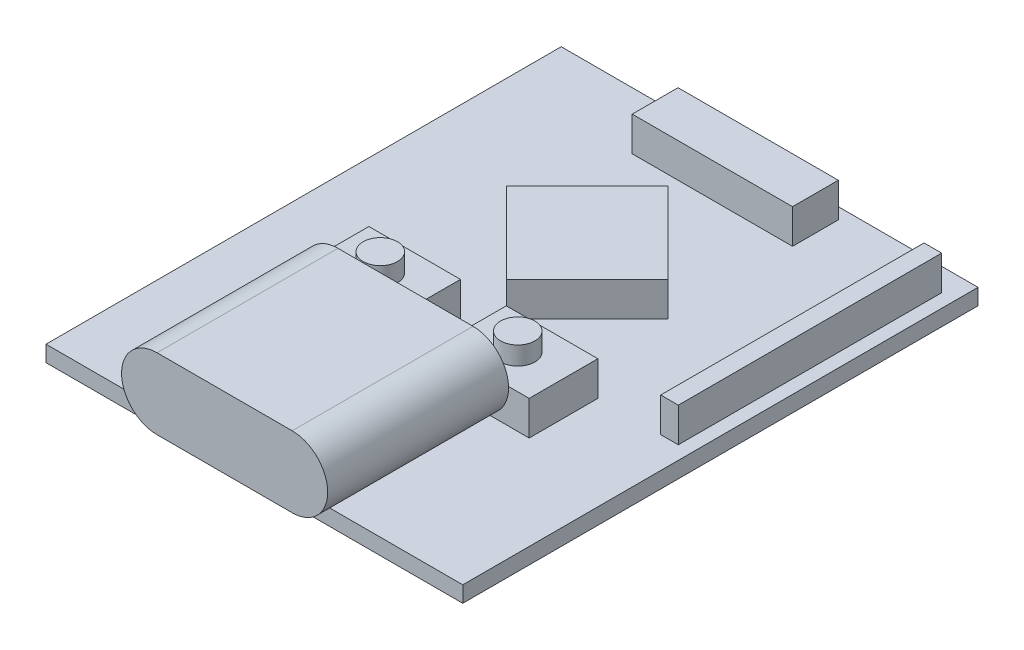
ISO-10303-21;
HEADER;
FILE_DESCRIPTION(('STEP AP214'),'2;1');
FILE_NAME('part.step','',(''),(''),'','','');
FILE_SCHEMA(('AUTOMOTIVE_DESIGN { 1 0 10303 214 1 1 1 1 }'));
ENDSEC;
DATA;
#1=APPLICATION_CONTEXT('core data for automotive mechanical design processes');
#2=APPLICATION_PROTOCOL_DEFINITION('international standard','automotive_design',2000,#1);
#3=PRODUCT_CONTEXT('',#1,'mechanical');
#4=PRODUCT('Part','Part','',(#3));
#5=PRODUCT_RELATED_PRODUCT_CATEGORY('part','',(#4));
#6=PRODUCT_DEFINITION_FORMATION('','',#4);
#7=PRODUCT_DEFINITION_CONTEXT('part definition',#1,'design');
#8=PRODUCT_DEFINITION('design','',#6,#7);
#9=PRODUCT_DEFINITION_SHAPE('','',#8);
#10=(LENGTH_UNIT() NAMED_UNIT(*) SI_UNIT(.MILLI.,.METRE.));
#11=(NAMED_UNIT(*) PLANE_ANGLE_UNIT() SI_UNIT($,.RADIAN.));
#12=(NAMED_UNIT(*) SI_UNIT($,.STERADIAN.) SOLID_ANGLE_UNIT());
#13=UNCERTAINTY_MEASURE_WITH_UNIT(LENGTH_MEASURE(1.E-05),#10,'distance_accuracy_value','');
#14=(GEOMETRIC_REPRESENTATION_CONTEXT(3) GLOBAL_UNCERTAINTY_ASSIGNED_CONTEXT((#13)) GLOBAL_UNIT_ASSIGNED_CONTEXT((#10,
#11,#12)) REPRESENTATION_CONTEXT('',''));
#15=CARTESIAN_POINT('',(0.,0.,0.));
#16=DIRECTION('',(0.,0.,1.));
#17=DIRECTION('',(1.,0.,0.));
#18=AXIS2_PLACEMENT_3D('',#15,#16,#17);
#19=CARTESIAN_POINT('',(-2.95,2.55,-6.6));
#20=DIRECTION('',(0.,0.,1.));
#21=DIRECTION('',(1.,0.,0.));
#22=AXIS2_PLACEMENT_3D('',#19,#20,#21);
#23=CYLINDRICAL_SURFACE('',#22,1.55);
#24=CARTESIAN_POINT('',(-2.95,2.55,1.3));
#25=DIRECTION('',(0.,0.,1.));
#26=DIRECTION('',(1.,0.,0.));
#27=AXIS2_PLACEMENT_3D('',#24,#25,#26);
#28=CIRCLE('',#27,1.55);
#29=CARTESIAN_POINT('',(-2.95,4.1,1.3));
#30=VERTEX_POINT('',#29);
#31=CARTESIAN_POINT('',(-2.95,1.,1.3));
#32=VERTEX_POINT('',#31);
#33=EDGE_CURVE('E109',#30,#32,#28,.T.);
#34=ORIENTED_EDGE('',*,*,#33,.F.);
#35=DIRECTION('',(0.,0.,1.));
#36=VECTOR('',#35,1.);
#37=CARTESIAN_POINT('',(-2.95,4.1,-6.6));
#38=LINE('',#37,#36);
#39=CARTESIAN_POINT('',(-2.95,4.1,-6.6));
#40=VERTEX_POINT('',#39);
#41=EDGE_CURVE('E12',#40,#30,#38,.T.);
#42=ORIENTED_EDGE('',*,*,#41,.F.);
#43=CARTESIAN_POINT('',(-2.95,2.55,-6.6));
#44=DIRECTION('',(0.,0.,1.));
#45=DIRECTION('',(1.,0.,0.));
#46=AXIS2_PLACEMENT_3D('',#43,#44,#45);
#47=CIRCLE('',#46,1.55);
#48=CARTESIAN_POINT('',(-2.95,1.,-6.6));
#49=VERTEX_POINT('',#48);
#50=EDGE_CURVE('E103',#40,#49,#47,.T.);
#51=ORIENTED_EDGE('',*,*,#50,.T.);
#52=DIRECTION('',(0.,0.,1.));
#53=VECTOR('',#52,1.);
#54=CARTESIAN_POINT('',(-2.95,1.,-6.6));
#55=LINE('',#54,#53);
#56=EDGE_CURVE('E48',#49,#32,#55,.T.);
#57=ORIENTED_EDGE('',*,*,#56,.T.);
#58=EDGE_LOOP('',(#34,#42,#51,#57));
#59=FACE_BOUND('',#58,.T.);
#60=ADVANCED_FACE('F45',(#59),#23,.T.);
#61=CARTESIAN_POINT('',(-2.95,4.1,-6.6));
#62=DIRECTION('',(0.,1.,0.));
#63=DIRECTION('',(-1.,0.,0.));
#64=AXIS2_PLACEMENT_3D('',#61,#62,#63);
#65=PLANE('',#64);
#66=DIRECTION('',(-1.,0.,0.));
#67=VECTOR('',#66,1.);
#68=CARTESIAN_POINT('',(-2.95,4.1,1.3));
#69=LINE('',#68,#67);
#70=CARTESIAN_POINT('',(2.95,4.1,1.3));
#71=VERTEX_POINT('',#70);
#72=EDGE_CURVE('E105',#71,#30,#69,.T.);
#73=ORIENTED_EDGE('',*,*,#72,.F.);
#74=DIRECTION('',(0.,0.,1.));
#75=VECTOR('',#74,1.);
#76=CARTESIAN_POINT('',(2.95,4.1,-6.6));
#77=LINE('',#76,#75);
#78=CARTESIAN_POINT('',(2.95,4.1,-6.6));
#79=VERTEX_POINT('',#78);
#80=EDGE_CURVE('E54',#79,#71,#77,.T.);
#81=ORIENTED_EDGE('',*,*,#80,.F.);
#82=DIRECTION('',(-1.,0.,0.));
#83=VECTOR('',#82,1.);
#84=CARTESIAN_POINT('',(-2.95,4.1,-6.6));
#85=LINE('',#84,#83);
#86=EDGE_CURVE('E100',#79,#40,#85,.T.);
#87=ORIENTED_EDGE('',*,*,#86,.T.);
#88=ORIENTED_EDGE('',*,*,#41,.T.);
#89=EDGE_LOOP('',(#73,#81,#87,#88));
#90=FACE_BOUND('',#89,.T.);
#91=ADVANCED_FACE('F119',(#90),#65,.T.);
#92=CARTESIAN_POINT('',(2.95,2.55,-6.6));
#93=DIRECTION('',(0.,0.,1.));
#94=DIRECTION('',(1.,0.,0.));
#95=AXIS2_PLACEMENT_3D('',#92,#93,#94);
#96=CYLINDRICAL_SURFACE('',#95,1.55);
#97=CARTESIAN_POINT('',(2.95,2.55,1.3));
#98=DIRECTION('',(0.,0.,1.));
#99=DIRECTION('',(1.,0.,0.));
#100=AXIS2_PLACEMENT_3D('',#97,#98,#99);
#101=CIRCLE('',#100,1.55);
#102=CARTESIAN_POINT('',(2.95,1.,1.3));
#103=VERTEX_POINT('',#102);
#104=EDGE_CURVE('E95',#103,#71,#101,.T.);
#105=ORIENTED_EDGE('',*,*,#104,.F.);
#106=DIRECTION('',(0.,0.,1.));
#107=VECTOR('',#106,1.);
#108=CARTESIAN_POINT('',(2.95,1.,-6.6));
#109=LINE('',#108,#107);
#110=CARTESIAN_POINT('',(2.95,1.,-6.6));
#111=VERTEX_POINT('',#110);
#112=EDGE_CURVE('E90',#111,#103,#109,.T.);
#113=ORIENTED_EDGE('',*,*,#112,.F.);
#114=CARTESIAN_POINT('',(2.95,2.55,-6.6));
#115=DIRECTION('',(0.,0.,1.));
#116=DIRECTION('',(1.,0.,0.));
#117=AXIS2_PLACEMENT_3D('',#114,#115,#116);
#118=CIRCLE('',#117,1.55);
#119=EDGE_CURVE('E93',#111,#79,#118,.T.);
#120=ORIENTED_EDGE('',*,*,#119,.T.);
#121=ORIENTED_EDGE('',*,*,#80,.T.);
#122=EDGE_LOOP('',(#105,#113,#120,#121));
#123=FACE_BOUND('',#122,.T.);
#124=ADVANCED_FACE('F92',(#123),#96,.T.);
#125=CARTESIAN_POINT('',(-2.95,1.,-6.6));
#126=DIRECTION('',(0.,-1.,0.));
#127=DIRECTION('',(1.,0.,0.));
#128=AXIS2_PLACEMENT_3D('',#125,#126,#127);
#129=PLANE('',#128);
#130=DIRECTION('',(1.,0.,0.));
#131=VECTOR('',#130,1.);
#132=CARTESIAN_POINT('',(-2.95,1.,1.3));
#133=LINE('',#132,#131);
#134=EDGE_CURVE('E112',#32,#103,#133,.T.);
#135=ORIENTED_EDGE('',*,*,#134,.F.);
#136=ORIENTED_EDGE('',*,*,#56,.F.);
#137=DIRECTION('',(1.,0.,0.));
#138=VECTOR('',#137,1.);
#139=CARTESIAN_POINT('',(-2.95,1.,-6.6));
#140=LINE('',#139,#138);
#141=EDGE_CURVE('E99',#49,#111,#140,.T.);
#142=ORIENTED_EDGE('',*,*,#141,.T.);
#143=ORIENTED_EDGE('',*,*,#112,.T.);
#144=EDGE_LOOP('',(#135,#136,#142,#143));
#145=FACE_BOUND('',#144,.T.);
#146=ADVANCED_FACE('F102',(#145),#129,.T.);
#147=CARTESIAN_POINT('',(-2.95,2.55,-6.6));
#148=DIRECTION('',(0.,0.,1.));
#149=DIRECTION('',(1.,0.,0.));
#150=AXIS2_PLACEMENT_3D('',#147,#148,#149);
#151=PLANE('',#150);
#152=ORIENTED_EDGE('',*,*,#50,.F.);
#153=ORIENTED_EDGE('',*,*,#86,.F.);
#154=ORIENTED_EDGE('',*,*,#119,.F.);
#155=ORIENTED_EDGE('',*,*,#141,.F.);
#156=EDGE_LOOP('',(#152,#153,#154,#155));
#157=FACE_BOUND('',#156,.T.);
#158=ADVANCED_FACE('F98',(#157),#151,.F.);
#159=CARTESIAN_POINT('',(-2.95,2.55,1.3));
#160=DIRECTION('',(0.,0.,1.));
#161=DIRECTION('',(1.,0.,0.));
#162=AXIS2_PLACEMENT_3D('',#159,#160,#161);
#163=PLANE('',#162);
#164=ORIENTED_EDGE('',*,*,#33,.T.);
#165=ORIENTED_EDGE('',*,*,#134,.T.);
#166=ORIENTED_EDGE('',*,*,#104,.T.);
#167=ORIENTED_EDGE('',*,*,#72,.T.);
#168=EDGE_LOOP('',(#164,#165,#166,#167));
#169=FACE_BOUND('',#168,.T.);
#170=ADVANCED_FACE('F118',(#169),#163,.T.);
#171=CLOSED_SHELL('',(#60,#91,#124,#146,#158,#170));
#172=MANIFOLD_SOLID_BREP('B2',#171);
#173=CARTESIAN_POINT('',(0.,0.7,0.));
#174=DIRECTION('',(0.,-1.,0.));
#175=DIRECTION('',(0.,0.,-1.));
#176=AXIS2_PLACEMENT_3D('',#173,#174,#175);
#177=PLANE('',#176);
#178=DIRECTION('',(-1.,0.,0.));
#179=VECTOR('',#178,1.);
#180=CARTESIAN_POINT('',(0.,0.7,-10.));
#181=LINE('',#180,#179);
#182=CARTESIAN_POINT('',(-0.999999999999998,0.7,-10.));
#183=VERTEX_POINT('',#182);
#184=CARTESIAN_POINT('',(-5.,0.7,-10.));
#185=VERTEX_POINT('',#184);
#186=EDGE_CURVE('E394',#183,#185,#181,.T.);
#187=ORIENTED_EDGE('',*,*,#186,.F.);
#188=DIRECTION('',(0.,0.,-1.));
#189=VECTOR('',#188,1.);
#190=CARTESIAN_POINT('',(-0.999999999999996,0.7,0.));
#191=LINE('',#190,#189);
#192=CARTESIAN_POINT('',(-0.999999999999997,0.7,-7.));
#193=VERTEX_POINT('',#192);
#194=EDGE_CURVE('E385',#193,#183,#191,.T.);
#195=ORIENTED_EDGE('',*,*,#194,.F.);
#196=DIRECTION('',(1.,0.,0.));
#197=VECTOR('',#196,1.);
#198=CARTESIAN_POINT('',(0.,0.7,-7.));
#199=LINE('',#198,#197);
#200=CARTESIAN_POINT('',(-5.,0.7,-7.));
#201=VERTEX_POINT('',#200);
#202=EDGE_CURVE('E388',#201,#193,#199,.T.);
#203=ORIENTED_EDGE('',*,*,#202,.F.);
#204=DIRECTION('',(0.,0.,1.));
#205=VECTOR('',#204,1.);
#206=CARTESIAN_POINT('',(-5.,0.7,0.));
#207=LINE('',#206,#205);
#208=EDGE_CURVE('E391',#185,#201,#207,.T.);
#209=ORIENTED_EDGE('',*,*,#208,.F.);
#210=EDGE_LOOP('',(#187,#195,#203,#209));
#211=FACE_BOUND('',#210,.T.);
#212=DIRECTION('',(0.,0.,1.));
#213=VECTOR('',#212,1.);
#214=CARTESIAN_POINT('',(1.,0.7,0.));
#215=LINE('',#214,#213);
#216=CARTESIAN_POINT('',(1.,0.7,-10.));
#217=VERTEX_POINT('',#216);
#218=CARTESIAN_POINT('',(1.,0.7,-7.));
#219=VERTEX_POINT('',#218);
#220=EDGE_CURVE('E460',#217,#219,#215,.T.);
#221=ORIENTED_EDGE('',*,*,#220,.F.);
#222=DIRECTION('',(-1.,0.,0.));
#223=VECTOR('',#222,1.);
#224=CARTESIAN_POINT('',(0.,0.7,-10.));
#225=LINE('',#224,#223);
#226=CARTESIAN_POINT('',(5.,0.7,-10.));
#227=VERTEX_POINT('',#226);
#228=EDGE_CURVE('E451',#227,#217,#225,.T.);
#229=ORIENTED_EDGE('',*,*,#228,.F.);
#230=DIRECTION('',(0.,0.,-1.));
#231=VECTOR('',#230,1.);
#232=CARTESIAN_POINT('',(5.,0.7,0.));
#233=LINE('',#232,#231);
#234=CARTESIAN_POINT('',(5.,0.7,-7.));
#235=VERTEX_POINT('',#234);
#236=EDGE_CURVE('E454',#235,#227,#233,.T.);
#237=ORIENTED_EDGE('',*,*,#236,.F.);
#238=DIRECTION('',(1.,0.,0.));
#239=VECTOR('',#238,1.);
#240=CARTESIAN_POINT('',(0.,0.7,-7.));
#241=LINE('',#240,#239);
#242=EDGE_CURVE('E457',#219,#235,#241,.T.);
#243=ORIENTED_EDGE('',*,*,#242,.F.);
#244=EDGE_LOOP('',(#221,#229,#237,#243));
#245=FACE_BOUND('',#244,.T.);
#246=DIRECTION('',(0.,0.,1.));
#247=VECTOR('',#246,1.);
#248=CARTESIAN_POINT('',(-9.1,0.7,0.));
#249=LINE('',#248,#247);
#250=CARTESIAN_POINT('',(-9.1,0.7,-22.5));
#251=VERTEX_POINT('',#250);
#252=CARTESIAN_POINT('',(-9.1,0.7,0.));
#253=VERTEX_POINT('',#252);
#254=EDGE_CURVE('E497',#251,#253,#249,.T.);
#255=ORIENTED_EDGE('',*,*,#254,.T.);
#256=DIRECTION('',(1.,0.,0.));
#257=VECTOR('',#256,1.);
#258=CARTESIAN_POINT('',(-9.1,0.7,0.));
#259=LINE('',#258,#257);
#260=CARTESIAN_POINT('',(9.1,0.7,0.));
#261=VERTEX_POINT('',#260);
#262=EDGE_CURVE('E500',#253,#261,#259,.T.);
#263=ORIENTED_EDGE('',*,*,#262,.T.);
#264=DIRECTION('',(0.,0.,-1.));
#265=VECTOR('',#264,1.);
#266=CARTESIAN_POINT('',(9.1,0.7,0.));
#267=LINE('',#266,#265);
#268=CARTESIAN_POINT('',(9.1,0.7,-22.5));
#269=VERTEX_POINT('',#268);
#270=EDGE_CURVE('E503',#261,#269,#267,.T.);
#271=ORIENTED_EDGE('',*,*,#270,.T.);
#272=DIRECTION('',(-1.,0.,0.));
#273=VECTOR('',#272,1.);
#274=CARTESIAN_POINT('',(-9.1,0.7,-22.5));
#275=LINE('',#274,#273);
#276=EDGE_CURVE('E505',#269,#251,#275,.T.);
#277=ORIENTED_EDGE('',*,*,#276,.T.);
#278=EDGE_LOOP('',(#255,#263,#271,#277));
#279=FACE_BOUND('',#278,.T.);
#280=DIRECTION('',(0.707106781186548,0.,0.707106781186547));
#281=VECTOR('',#280,1.);
#282=CARTESIAN_POINT('',(5.5,0.7,-5.50000000000001));
#283=LINE('',#282,#281);
#284=CARTESIAN_POINT('',(-3.53553390593274,0.7,-14.5355339059327));
#285=VERTEX_POINT('',#284);
#286=CARTESIAN_POINT('',(0.,0.7,-11.));
#287=VERTEX_POINT('',#286);
#288=EDGE_CURVE('E493',#285,#287,#283,.T.);
#289=ORIENTED_EDGE('',*,*,#288,.F.);
#290=DIRECTION('',(-0.707106781186548,0.,0.707106781186547));
#291=VECTOR('',#290,1.);
#292=CARTESIAN_POINT('',(-9.03553390593274,0.7,-9.03553390593274));
#293=LINE('',#292,#291);
#294=CARTESIAN_POINT('',(0.,0.7,-18.0710678118655));
#295=VERTEX_POINT('',#294);
#296=EDGE_CURVE('E484',#295,#285,#293,.T.);
#297=ORIENTED_EDGE('',*,*,#296,.F.);
#298=DIRECTION('',(-0.707106781186548,0.,-0.707106781186547));
#299=VECTOR('',#298,1.);
#300=CARTESIAN_POINT('',(9.03553390593274,0.7,-9.03553390593274));
#301=LINE('',#300,#299);
#302=CARTESIAN_POINT('',(3.53553390593274,0.7,-14.5355339059327));
#303=VERTEX_POINT('',#302);
#304=EDGE_CURVE('E487',#303,#295,#301,.T.);
#305=ORIENTED_EDGE('',*,*,#304,.F.);
#306=DIRECTION('',(0.707106781186547,0.,-0.707106781186548));
#307=VECTOR('',#306,1.);
#308=CARTESIAN_POINT('',(-5.5,0.7,-5.5));
#309=LINE('',#308,#307);
#310=EDGE_CURVE('E490',#287,#303,#309,.T.);
#311=ORIENTED_EDGE('',*,*,#310,.F.);
#312=EDGE_LOOP('',(#289,#297,#305,#311));
#313=FACE_BOUND('',#312,.T.);
#314=DIRECTION('',(0.,0.,1.));
#315=VECTOR('',#314,1.);
#316=CARTESIAN_POINT('',(-3.5,0.7,0.));
#317=LINE('',#316,#315);
#318=CARTESIAN_POINT('',(-3.5,0.7,-22.));
#319=VERTEX_POINT('',#318);
#320=CARTESIAN_POINT('',(-3.5,0.7,-20.));
#321=VERTEX_POINT('',#320);
#322=EDGE_CURVE('E427',#319,#321,#317,.T.);
#323=ORIENTED_EDGE('',*,*,#322,.F.);
#324=DIRECTION('',(-1.,0.,0.));
#325=VECTOR('',#324,1.);
#326=CARTESIAN_POINT('',(0.,0.7,-22.));
#327=LINE('',#326,#325);
#328=CARTESIAN_POINT('',(3.5,0.7,-22.));
#329=VERTEX_POINT('',#328);
#330=EDGE_CURVE('E418',#329,#319,#327,.T.);
#331=ORIENTED_EDGE('',*,*,#330,.F.);
#332=DIRECTION('',(0.,0.,-1.));
#333=VECTOR('',#332,1.);
#334=CARTESIAN_POINT('',(3.49999999999999,0.7,0.));
#335=LINE('',#334,#333);
#336=CARTESIAN_POINT('',(3.5,0.7,-20.));
#337=VERTEX_POINT('',#336);
#338=EDGE_CURVE('E421',#337,#329,#335,.T.);
#339=ORIENTED_EDGE('',*,*,#338,.F.);
#340=DIRECTION('',(1.,0.,0.));
#341=VECTOR('',#340,1.);
#342=CARTESIAN_POINT('',(0.,0.7,-20.));
#343=LINE('',#342,#341);
#344=EDGE_CURVE('E424',#321,#337,#343,.T.);
#345=ORIENTED_EDGE('',*,*,#344,.F.);
#346=EDGE_LOOP('',(#323,#331,#339,#345));
#347=FACE_BOUND('',#346,.T.);
#348=DIRECTION('',(0.,0.,1.));
#349=VECTOR('',#348,1.);
#350=CARTESIAN_POINT('',(7.7437978616926,0.7,0.));
#351=LINE('',#350,#349);
#352=CARTESIAN_POINT('',(7.7437978616926,0.7,-21.5));
#353=VERTEX_POINT('',#352);
#354=CARTESIAN_POINT('',(7.7437978616926,0.7,-10.));
#355=VERTEX_POINT('',#354);
#356=EDGE_CURVE('E352',#353,#355,#351,.T.);
#357=ORIENTED_EDGE('',*,*,#356,.F.);
#358=DIRECTION('',(-1.,0.,0.));
#359=VECTOR('',#358,1.);
#360=CARTESIAN_POINT('',(0.,0.7,-21.5));
#361=LINE('',#360,#359);
#362=CARTESIAN_POINT('',(8.51186104562512,0.7,-21.5));
#363=VERTEX_POINT('',#362);
#364=EDGE_CURVE('E353',#363,#353,#361,.T.);
#365=ORIENTED_EDGE('',*,*,#364,.F.);
#366=DIRECTION('',(0.,0.,-1.));
#367=VECTOR('',#366,1.);
#368=CARTESIAN_POINT('',(8.51186104562511,0.7,0.));
#369=LINE('',#368,#367);
#370=CARTESIAN_POINT('',(8.51186104562511,0.7,-10.));
#371=VERTEX_POINT('',#370);
#372=EDGE_CURVE('E191',#371,#363,#369,.T.);
#373=ORIENTED_EDGE('',*,*,#372,.F.);
#374=DIRECTION('',(1.,0.,0.));
#375=VECTOR('',#374,1.);
#376=CARTESIAN_POINT('',(0.,0.7,-10.));
#377=LINE('',#376,#375);
#378=EDGE_CURVE('E186',#355,#371,#377,.T.);
#379=ORIENTED_EDGE('',*,*,#378,.F.);
#380=EDGE_LOOP('',(#357,#365,#373,#379));
#381=FACE_BOUND('',#380,.T.);
#382=ADVANCED_FACE('F169',(#211,#245,#279,#313,#347,#381),#177,.F.);
#383=CARTESIAN_POINT('',(-9.1,0.7,0.));
#384=DIRECTION('',(1.,0.,0.));
#385=DIRECTION('',(0.,0.,-1.));
#386=AXIS2_PLACEMENT_3D('',#383,#384,#385);
#387=PLANE('',#386);
#388=DIRECTION('',(0.,0.,1.));
#389=VECTOR('',#388,1.);
#390=CARTESIAN_POINT('',(-9.1,0.,0.));
#391=LINE('',#390,#389);
#392=CARTESIAN_POINT('',(-9.1,0.,-22.5));
#393=VERTEX_POINT('',#392);
#394=CARTESIAN_POINT('',(-9.1,0.,0.));
#395=VERTEX_POINT('',#394);
#396=EDGE_CURVE('E496',#393,#395,#391,.T.);
#397=ORIENTED_EDGE('',*,*,#396,.T.);
#398=DIRECTION('',(0.,-1.,0.));
#399=VECTOR('',#398,1.);
#400=CARTESIAN_POINT('',(-9.1,0.7,0.));
#401=LINE('',#400,#399);
#402=EDGE_CURVE('E43',#253,#395,#401,.T.);
#403=ORIENTED_EDGE('',*,*,#402,.F.);
#404=ORIENTED_EDGE('',*,*,#254,.F.);
#405=DIRECTION('',(0.,-1.,0.));
#406=VECTOR('',#405,1.);
#407=CARTESIAN_POINT('',(-9.1,0.7,-22.5));
#408=LINE('',#407,#406);
#409=EDGE_CURVE('E507',#251,#393,#408,.T.);
#410=ORIENTED_EDGE('',*,*,#409,.T.);
#411=EDGE_LOOP('',(#397,#403,#404,#410));
#412=FACE_BOUND('',#411,.T.);
#413=ADVANCED_FACE('F171',(#412),#387,.F.);
#414=CARTESIAN_POINT('',(-9.1,0.7,0.));
#415=DIRECTION('',(0.,0.,-1.));
#416=DIRECTION('',(-1.,0.,0.));
#417=AXIS2_PLACEMENT_3D('',#414,#415,#416);
#418=PLANE('',#417);
#419=DIRECTION('',(1.,0.,0.));
#420=VECTOR('',#419,1.);
#421=CARTESIAN_POINT('',(-9.1,0.,0.));
#422=LINE('',#421,#420);
#423=CARTESIAN_POINT('',(9.1,0.,0.));
#424=VERTEX_POINT('',#423);
#425=EDGE_CURVE('E510',#395,#424,#422,.T.);
#426=ORIENTED_EDGE('',*,*,#425,.T.);
#427=DIRECTION('',(0.,-1.,0.));
#428=VECTOR('',#427,1.);
#429=CARTESIAN_POINT('',(9.1,0.7,0.));
#430=LINE('',#429,#428);
#431=EDGE_CURVE('E178',#261,#424,#430,.T.);
#432=ORIENTED_EDGE('',*,*,#431,.F.);
#433=ORIENTED_EDGE('',*,*,#262,.F.);
#434=ORIENTED_EDGE('',*,*,#402,.T.);
#435=EDGE_LOOP('',(#426,#432,#433,#434));
#436=FACE_BOUND('',#435,.T.);
#437=ADVANCED_FACE('F556',(#436),#418,.F.);
#438=CARTESIAN_POINT('',(9.1,0.7,0.));
#439=DIRECTION('',(-1.,0.,0.));
#440=DIRECTION('',(0.,0.,1.));
#441=AXIS2_PLACEMENT_3D('',#438,#439,#440);
#442=PLANE('',#441);
#443=DIRECTION('',(0.,0.,-1.));
#444=VECTOR('',#443,1.);
#445=CARTESIAN_POINT('',(9.1,0.,0.));
#446=LINE('',#445,#444);
#447=CARTESIAN_POINT('',(9.1,0.,-22.5));
#448=VERTEX_POINT('',#447);
#449=EDGE_CURVE('E512',#424,#448,#446,.T.);
#450=ORIENTED_EDGE('',*,*,#449,.T.);
#451=DIRECTION('',(0.,-1.,0.));
#452=VECTOR('',#451,1.);
#453=CARTESIAN_POINT('',(9.1,0.7,-22.5));
#454=LINE('',#453,#452);
#455=EDGE_CURVE('E517',#269,#448,#454,.T.);
#456=ORIENTED_EDGE('',*,*,#455,.F.);
#457=ORIENTED_EDGE('',*,*,#270,.F.);
#458=ORIENTED_EDGE('',*,*,#431,.T.);
#459=EDGE_LOOP('',(#450,#456,#457,#458));
#460=FACE_BOUND('',#459,.T.);
#461=ADVANCED_FACE('F570',(#460),#442,.F.);
#462=CARTESIAN_POINT('',(-9.1,0.7,-22.5));
#463=DIRECTION('',(0.,0.,1.));
#464=DIRECTION('',(1.,0.,0.));
#465=AXIS2_PLACEMENT_3D('',#462,#463,#464);
#466=PLANE('',#465);
#467=DIRECTION('',(-1.,0.,0.));
#468=VECTOR('',#467,1.);
#469=CARTESIAN_POINT('',(-9.1,0.,-22.5));
#470=LINE('',#469,#468);
#471=EDGE_CURVE('E501',#448,#393,#470,.T.);
#472=ORIENTED_EDGE('',*,*,#471,.T.);
#473=ORIENTED_EDGE('',*,*,#409,.F.);
#474=ORIENTED_EDGE('',*,*,#276,.F.);
#475=ORIENTED_EDGE('',*,*,#455,.T.);
#476=EDGE_LOOP('',(#472,#473,#474,#475));
#477=FACE_BOUND('',#476,.T.);
#478=ADVANCED_FACE('F566',(#477),#466,.F.);
#479=CARTESIAN_POINT('',(0.,0.,0.));
#480=DIRECTION('',(0.,-1.,0.));
#481=DIRECTION('',(0.,0.,-1.));
#482=AXIS2_PLACEMENT_3D('',#479,#480,#481);
#483=PLANE('',#482);
#484=ORIENTED_EDGE('',*,*,#396,.F.);
#485=ORIENTED_EDGE('',*,*,#471,.F.);
#486=ORIENTED_EDGE('',*,*,#449,.F.);
#487=ORIENTED_EDGE('',*,*,#425,.F.);
#488=EDGE_LOOP('',(#484,#485,#486,#487));
#489=FACE_BOUND('',#488,.T.);
#490=ADVANCED_FACE('F563',(#489),#483,.T.);
#491=CARTESIAN_POINT('',(-3.53553390593274,2.2,-14.5355339059327));
#492=DIRECTION('',(0.707106781186547,0.,-0.707106781186548));
#493=DIRECTION('',(-0.707106781186548,0.,-0.707106781186547));
#494=AXIS2_PLACEMENT_3D('',#491,#492,#493);
#495=PLANE('',#494);
#496=DIRECTION('',(0.,-1.,0.));
#497=VECTOR('',#496,1.);
#498=CARTESIAN_POINT('',(-3.53553390593274,2.2,-14.5355339059327));
#499=LINE('',#498,#497);
#500=CARTESIAN_POINT('',(-3.53553390593274,2.2,-14.5355339059327));
#501=VERTEX_POINT('',#500);
#502=EDGE_CURVE('E472',#501,#285,#499,.T.);
#503=ORIENTED_EDGE('',*,*,#502,.T.);
#504=ORIENTED_EDGE('',*,*,#288,.T.);
#505=DIRECTION('',(0.,-1.,0.));
#506=VECTOR('',#505,1.);
#507=CARTESIAN_POINT('',(0.,2.2,-11.));
#508=LINE('',#507,#506);
#509=CARTESIAN_POINT('',(0.,2.2,-11.));
#510=VERTEX_POINT('',#509);
#511=EDGE_CURVE('E481',#510,#287,#508,.T.);
#512=ORIENTED_EDGE('',*,*,#511,.F.);
#513=DIRECTION('',(0.707106781186548,0.,0.707106781186547));
#514=VECTOR('',#513,1.);
#515=CARTESIAN_POINT('',(-3.53553390593274,2.2,-14.5355339059327));
#516=LINE('',#515,#514);
#517=EDGE_CURVE('E463',#501,#510,#516,.T.);
#518=ORIENTED_EDGE('',*,*,#517,.F.);
#519=EDGE_LOOP('',(#503,#504,#512,#518));
#520=FACE_BOUND('',#519,.T.);
#521=ADVANCED_FACE('F561',(#520),#495,.F.);
#522=CARTESIAN_POINT('',(0.,2.2,-11.));
#523=DIRECTION('',(-0.707106781186548,0.,-0.707106781186547));
#524=DIRECTION('',(-0.707106781186547,0.,0.707106781186548));
#525=AXIS2_PLACEMENT_3D('',#522,#523,#524);
#526=PLANE('',#525);
#527=ORIENTED_EDGE('',*,*,#511,.T.);
#528=ORIENTED_EDGE('',*,*,#310,.T.);
#529=DIRECTION('',(0.,-1.,0.));
#530=VECTOR('',#529,1.);
#531=CARTESIAN_POINT('',(3.53553390593274,2.2,-14.5355339059327));
#532=LINE('',#531,#530);
#533=CARTESIAN_POINT('',(3.53553390593274,2.2,-14.5355339059327));
#534=VERTEX_POINT('',#533);
#535=EDGE_CURVE('E478',#534,#303,#532,.T.);
#536=ORIENTED_EDGE('',*,*,#535,.F.);
#537=DIRECTION('',(0.707106781186547,0.,-0.707106781186548));
#538=VECTOR('',#537,1.);
#539=CARTESIAN_POINT('',(0.,2.2,-11.));
#540=LINE('',#539,#538);
#541=EDGE_CURVE('E466',#510,#534,#540,.T.);
#542=ORIENTED_EDGE('',*,*,#541,.F.);
#543=EDGE_LOOP('',(#527,#528,#536,#542));
#544=FACE_BOUND('',#543,.T.);
#545=ADVANCED_FACE('F647',(#544),#526,.F.);
#546=CARTESIAN_POINT('',(0.,2.2,-18.0710678118655));
#547=DIRECTION('',(-0.707106781186547,0.,0.707106781186548));
#548=DIRECTION('',(0.707106781186548,0.,0.707106781186547));
#549=AXIS2_PLACEMENT_3D('',#546,#547,#548);
#550=PLANE('',#549);
#551=ORIENTED_EDGE('',*,*,#535,.T.);
#552=ORIENTED_EDGE('',*,*,#304,.T.);
#553=DIRECTION('',(0.,-1.,0.));
#554=VECTOR('',#553,1.);
#555=CARTESIAN_POINT('',(0.,2.2,-18.0710678118655));
#556=LINE('',#555,#554);
#557=CARTESIAN_POINT('',(0.,2.2,-18.0710678118655));
#558=VERTEX_POINT('',#557);
#559=EDGE_CURVE('E475',#558,#295,#556,.T.);
#560=ORIENTED_EDGE('',*,*,#559,.F.);
#561=DIRECTION('',(-0.707106781186548,0.,-0.707106781186547));
#562=VECTOR('',#561,1.);
#563=CARTESIAN_POINT('',(0.,2.2,-18.0710678118655));
#564=LINE('',#563,#562);
#565=EDGE_CURVE('E468',#534,#558,#564,.T.);
#566=ORIENTED_EDGE('',*,*,#565,.F.);
#567=EDGE_LOOP('',(#551,#552,#560,#566));
#568=FACE_BOUND('',#567,.T.);
#569=ADVANCED_FACE('F644',(#568),#550,.F.);
#570=CARTESIAN_POINT('',(-3.53553390593274,2.2,-14.5355339059327));
#571=DIRECTION('',(0.707106781186547,0.,0.707106781186548));
#572=DIRECTION('',(0.707106781186548,0.,-0.707106781186547));
#573=AXIS2_PLACEMENT_3D('',#570,#571,#572);
#574=PLANE('',#573);
#575=ORIENTED_EDGE('',*,*,#559,.T.);
#576=ORIENTED_EDGE('',*,*,#296,.T.);
#577=ORIENTED_EDGE('',*,*,#502,.F.);
#578=DIRECTION('',(-0.707106781186548,0.,0.707106781186547));
#579=VECTOR('',#578,1.);
#580=CARTESIAN_POINT('',(-3.53553390593274,2.2,-14.5355339059327));
#581=LINE('',#580,#579);
#582=EDGE_CURVE('E470',#558,#501,#581,.T.);
#583=ORIENTED_EDGE('',*,*,#582,.F.);
#584=EDGE_LOOP('',(#575,#576,#577,#583));
#585=FACE_BOUND('',#584,.T.);
#586=ADVANCED_FACE('F640',(#585),#574,.F.);
#587=CARTESIAN_POINT('',(0.,2.2,0.));
#588=DIRECTION('',(0.,1.,0.));
#589=DIRECTION('',(0.,0.,1.));
#590=AXIS2_PLACEMENT_3D('',#587,#588,#589);
#591=PLANE('',#590);
#592=ORIENTED_EDGE('',*,*,#517,.T.);
#593=ORIENTED_EDGE('',*,*,#541,.T.);
#594=ORIENTED_EDGE('',*,*,#565,.T.);
#595=ORIENTED_EDGE('',*,*,#582,.T.);
#596=EDGE_LOOP('',(#592,#593,#594,#595));
#597=FACE_BOUND('',#596,.T.);
#598=ADVANCED_FACE('F636',(#597),#591,.T.);
#599=CARTESIAN_POINT('',(1.,2.2,-10.));
#600=DIRECTION('',(1.,0.,0.));
#601=DIRECTION('',(0.,0.,-1.));
#602=AXIS2_PLACEMENT_3D('',#599,#600,#601);
#603=PLANE('',#602);
#604=DIRECTION('',(0.,-1.,0.));
#605=VECTOR('',#604,1.);
#606=CARTESIAN_POINT('',(1.,2.2,-10.));
#607=LINE('',#606,#605);
#608=CARTESIAN_POINT('',(1.,2.2,-10.));
#609=VERTEX_POINT('',#608);
#610=EDGE_CURVE('E439',#609,#217,#607,.T.);
#611=ORIENTED_EDGE('',*,*,#610,.T.);
#612=ORIENTED_EDGE('',*,*,#220,.T.);
#613=DIRECTION('',(0.,-1.,0.));
#614=VECTOR('',#613,1.);
#615=CARTESIAN_POINT('',(1.,2.2,-7.));
#616=LINE('',#615,#614);
#617=CARTESIAN_POINT('',(1.,2.2,-7.));
#618=VERTEX_POINT('',#617);
#619=EDGE_CURVE('E448',#618,#219,#616,.T.);
#620=ORIENTED_EDGE('',*,*,#619,.F.);
#621=DIRECTION('',(0.,0.,1.));
#622=VECTOR('',#621,1.);
#623=CARTESIAN_POINT('',(1.,2.2,-10.));
#624=LINE('',#623,#622);
#625=EDGE_CURVE('E430',#609,#618,#624,.T.);
#626=ORIENTED_EDGE('',*,*,#625,.F.);
#627=EDGE_LOOP('',(#611,#612,#620,#626));
#628=FACE_BOUND('',#627,.T.);
#629=ADVANCED_FACE('F632',(#628),#603,.F.);
#630=CARTESIAN_POINT('',(1.,2.2,-7.));
#631=DIRECTION('',(0.,0.,-1.));
#632=DIRECTION('',(-1.,0.,0.));
#633=AXIS2_PLACEMENT_3D('',#630,#631,#632);
#634=PLANE('',#633);
#635=ORIENTED_EDGE('',*,*,#619,.T.);
#636=ORIENTED_EDGE('',*,*,#242,.T.);
#637=DIRECTION('',(0.,-1.,0.));
#638=VECTOR('',#637,1.);
#639=CARTESIAN_POINT('',(5.,2.2,-7.));
#640=LINE('',#639,#638);
#641=CARTESIAN_POINT('',(5.,2.2,-7.));
#642=VERTEX_POINT('',#641);
#643=EDGE_CURVE('E445',#642,#235,#640,.T.);
#644=ORIENTED_EDGE('',*,*,#643,.F.);
#645=DIRECTION('',(1.,0.,0.));
#646=VECTOR('',#645,1.);
#647=CARTESIAN_POINT('',(1.,2.2,-7.));
#648=LINE('',#647,#646);
#649=EDGE_CURVE('E433',#618,#642,#648,.T.);
#650=ORIENTED_EDGE('',*,*,#649,.F.);
#651=EDGE_LOOP('',(#635,#636,#644,#650));
#652=FACE_BOUND('',#651,.T.);
#653=ADVANCED_FACE('F628',(#652),#634,.F.);
#654=CARTESIAN_POINT('',(5.,2.2,-10.));
#655=DIRECTION('',(-1.,0.,0.));
#656=DIRECTION('',(0.,0.,1.));
#657=AXIS2_PLACEMENT_3D('',#654,#655,#656);
#658=PLANE('',#657);
#659=ORIENTED_EDGE('',*,*,#643,.T.);
#660=ORIENTED_EDGE('',*,*,#236,.T.);
#661=DIRECTION('',(0.,-1.,0.));
#662=VECTOR('',#661,1.);
#663=CARTESIAN_POINT('',(5.,2.2,-10.));
#664=LINE('',#663,#662);
#665=CARTESIAN_POINT('',(5.,2.2,-10.));
#666=VERTEX_POINT('',#665);
#667=EDGE_CURVE('E442',#666,#227,#664,.T.);
#668=ORIENTED_EDGE('',*,*,#667,.F.);
#669=DIRECTION('',(0.,0.,-1.));
#670=VECTOR('',#669,1.);
#671=CARTESIAN_POINT('',(5.,2.2,-10.));
#672=LINE('',#671,#670);
#673=EDGE_CURVE('E435',#642,#666,#672,.T.);
#674=ORIENTED_EDGE('',*,*,#673,.F.);
#675=EDGE_LOOP('',(#659,#660,#668,#674));
#676=FACE_BOUND('',#675,.T.);
#677=ADVANCED_FACE('F624',(#676),#658,.F.);
#678=CARTESIAN_POINT('',(1.,2.2,-10.));
#679=DIRECTION('',(0.,0.,1.));
#680=DIRECTION('',(1.,0.,0.));
#681=AXIS2_PLACEMENT_3D('',#678,#679,#680);
#682=PLANE('',#681);
#683=ORIENTED_EDGE('',*,*,#667,.T.);
#684=ORIENTED_EDGE('',*,*,#228,.T.);
#685=ORIENTED_EDGE('',*,*,#610,.F.);
#686=DIRECTION('',(-1.,0.,0.));
#687=VECTOR('',#686,1.);
#688=CARTESIAN_POINT('',(1.,2.2,-10.));
#689=LINE('',#688,#687);
#690=EDGE_CURVE('E437',#666,#609,#689,.T.);
#691=ORIENTED_EDGE('',*,*,#690,.F.);
#692=EDGE_LOOP('',(#683,#684,#685,#691));
#693=FACE_BOUND('',#692,.T.);
#694=ADVANCED_FACE('F621',(#693),#682,.F.);
#695=CARTESIAN_POINT('',(0.,2.2,0.));
#696=DIRECTION('',(0.,1.,0.));
#697=DIRECTION('',(0.,0.,1.));
#698=AXIS2_PLACEMENT_3D('',#695,#696,#697);
#699=PLANE('',#698);
#700=CARTESIAN_POINT('',(3.,2.2,-8.5));
#701=DIRECTION('',(0.,1.,0.));
#702=DIRECTION('',(0.,0.,1.));
#703=AXIS2_PLACEMENT_3D('',#700,#701,#702);
#704=CIRCLE('',#703,0.75);
#705=CARTESIAN_POINT('',(3.,2.2,-7.75));
#706=VERTEX_POINT('',#705);
#707=EDGE_CURVE('E349',#706,#706,#704,.F.);
#708=ORIENTED_EDGE('',*,*,#707,.T.);
#709=EDGE_LOOP('',(#708));
#710=FACE_BOUND('',#709,.T.);
#711=ORIENTED_EDGE('',*,*,#625,.T.);
#712=ORIENTED_EDGE('',*,*,#649,.T.);
#713=ORIENTED_EDGE('',*,*,#673,.T.);
#714=ORIENTED_EDGE('',*,*,#690,.T.);
#715=EDGE_LOOP('',(#711,#712,#713,#714));
#716=FACE_BOUND('',#715,.T.);
#717=ADVANCED_FACE('F615',(#710,#716),#699,.T.);
#718=CARTESIAN_POINT('',(-3.5,2.2,-22.));
#719=DIRECTION('',(1.,0.,0.));
#720=DIRECTION('',(0.,0.,-1.));
#721=AXIS2_PLACEMENT_3D('',#718,#719,#720);
#722=PLANE('',#721);
#723=DIRECTION('',(0.,-1.,0.));
#724=VECTOR('',#723,1.);
#725=CARTESIAN_POINT('',(-3.5,2.2,-22.));
#726=LINE('',#725,#724);
#727=CARTESIAN_POINT('',(-3.5,2.2,-22.));
#728=VERTEX_POINT('',#727);
#729=EDGE_CURVE('E406',#728,#319,#726,.T.);
#730=ORIENTED_EDGE('',*,*,#729,.T.);
#731=ORIENTED_EDGE('',*,*,#322,.T.);
#732=DIRECTION('',(0.,-1.,0.));
#733=VECTOR('',#732,1.);
#734=CARTESIAN_POINT('',(-3.5,2.2,-20.));
#735=LINE('',#734,#733);
#736=CARTESIAN_POINT('',(-3.5,2.2,-20.));
#737=VERTEX_POINT('',#736);
#738=EDGE_CURVE('E415',#737,#321,#735,.T.);
#739=ORIENTED_EDGE('',*,*,#738,.F.);
#740=DIRECTION('',(0.,0.,1.));
#741=VECTOR('',#740,1.);
#742=CARTESIAN_POINT('',(-3.5,2.2,-22.));
#743=LINE('',#742,#741);
#744=EDGE_CURVE('E397',#728,#737,#743,.T.);
#745=ORIENTED_EDGE('',*,*,#744,.F.);
#746=EDGE_LOOP('',(#730,#731,#739,#745));
#747=FACE_BOUND('',#746,.T.);
#748=ADVANCED_FACE('F599',(#747),#722,.F.);
#749=CARTESIAN_POINT('',(-3.5,2.2,-20.));
#750=DIRECTION('',(0.,0.,-1.));
#751=DIRECTION('',(-1.,0.,0.));
#752=AXIS2_PLACEMENT_3D('',#749,#750,#751);
#753=PLANE('',#752);
#754=ORIENTED_EDGE('',*,*,#738,.T.);
#755=ORIENTED_EDGE('',*,*,#344,.T.);
#756=DIRECTION('',(0.,-1.,0.));
#757=VECTOR('',#756,1.);
#758=CARTESIAN_POINT('',(3.5,2.2,-20.));
#759=LINE('',#758,#757);
#760=CARTESIAN_POINT('',(3.5,2.2,-20.));
#761=VERTEX_POINT('',#760);
#762=EDGE_CURVE('E412',#761,#337,#759,.T.);
#763=ORIENTED_EDGE('',*,*,#762,.F.);
#764=DIRECTION('',(1.,0.,0.));
#765=VECTOR('',#764,1.);
#766=CARTESIAN_POINT('',(-3.5,2.2,-20.));
#767=LINE('',#766,#765);
#768=EDGE_CURVE('E400',#737,#761,#767,.T.);
#769=ORIENTED_EDGE('',*,*,#768,.F.);
#770=EDGE_LOOP('',(#754,#755,#763,#769));
#771=FACE_BOUND('',#770,.T.);
#772=ADVANCED_FACE('F607',(#771),#753,.F.);
#773=CARTESIAN_POINT('',(3.5,2.2,-22.));
#774=DIRECTION('',(-1.,0.,0.));
#775=DIRECTION('',(0.,0.,1.));
#776=AXIS2_PLACEMENT_3D('',#773,#774,#775);
#777=PLANE('',#776);
#778=ORIENTED_EDGE('',*,*,#762,.T.);
#779=ORIENTED_EDGE('',*,*,#338,.T.);
#780=DIRECTION('',(0.,-1.,0.));
#781=VECTOR('',#780,1.);
#782=CARTESIAN_POINT('',(3.5,2.2,-22.));
#783=LINE('',#782,#781);
#784=CARTESIAN_POINT('',(3.5,2.2,-22.));
#785=VERTEX_POINT('',#784);
#786=EDGE_CURVE('E409',#785,#329,#783,.T.);
#787=ORIENTED_EDGE('',*,*,#786,.F.);
#788=DIRECTION('',(0.,0.,-1.));
#789=VECTOR('',#788,1.);
#790=CARTESIAN_POINT('',(3.5,2.2,-22.));
#791=LINE('',#790,#789);
#792=EDGE_CURVE('E402',#761,#785,#791,.T.);
#793=ORIENTED_EDGE('',*,*,#792,.F.);
#794=EDGE_LOOP('',(#778,#779,#787,#793));
#795=FACE_BOUND('',#794,.T.);
#796=ADVANCED_FACE('F605',(#795),#777,.F.);
#797=CARTESIAN_POINT('',(-3.5,2.2,-22.));
#798=DIRECTION('',(0.,0.,1.));
#799=DIRECTION('',(1.,0.,0.));
#800=AXIS2_PLACEMENT_3D('',#797,#798,#799);
#801=PLANE('',#800);
#802=ORIENTED_EDGE('',*,*,#786,.T.);
#803=ORIENTED_EDGE('',*,*,#330,.T.);
#804=ORIENTED_EDGE('',*,*,#729,.F.);
#805=DIRECTION('',(-1.,0.,0.));
#806=VECTOR('',#805,1.);
#807=CARTESIAN_POINT('',(-3.5,2.2,-22.));
#808=LINE('',#807,#806);
#809=EDGE_CURVE('E404',#785,#728,#808,.T.);
#810=ORIENTED_EDGE('',*,*,#809,.F.);
#811=EDGE_LOOP('',(#802,#803,#804,#810));
#812=FACE_BOUND('',#811,.T.);
#813=ADVANCED_FACE('F595',(#812),#801,.F.);
#814=CARTESIAN_POINT('',(0.,2.2,0.));
#815=DIRECTION('',(0.,1.,0.));
#816=DIRECTION('',(0.,0.,1.));
#817=AXIS2_PLACEMENT_3D('',#814,#815,#816);
#818=PLANE('',#817);
#819=ORIENTED_EDGE('',*,*,#744,.T.);
#820=ORIENTED_EDGE('',*,*,#768,.T.);
#821=ORIENTED_EDGE('',*,*,#792,.T.);
#822=ORIENTED_EDGE('',*,*,#809,.T.);
#823=EDGE_LOOP('',(#819,#820,#821,#822));
#824=FACE_BOUND('',#823,.T.);
#825=ADVANCED_FACE('F601',(#824),#818,.T.);
#826=CARTESIAN_POINT('',(-0.999999999999998,2.2,-10.));
#827=DIRECTION('',(0.,0.,1.));
#828=DIRECTION('',(1.,0.,0.));
#829=AXIS2_PLACEMENT_3D('',#826,#827,#828);
#830=PLANE('',#829);
#831=DIRECTION('',(0.,-1.,0.));
#832=VECTOR('',#831,1.);
#833=CARTESIAN_POINT('',(-0.999999999999998,2.2,-10.));
#834=LINE('',#833,#832);
#835=CARTESIAN_POINT('',(-0.999999999999998,2.2,-10.));
#836=VERTEX_POINT('',#835);
#837=EDGE_CURVE('E373',#836,#183,#834,.T.);
#838=ORIENTED_EDGE('',*,*,#837,.T.);
#839=ORIENTED_EDGE('',*,*,#186,.T.);
#840=DIRECTION('',(0.,-1.,0.));
#841=VECTOR('',#840,1.);
#842=CARTESIAN_POINT('',(-5.,2.2,-10.));
#843=LINE('',#842,#841);
#844=CARTESIAN_POINT('',(-5.,2.2,-10.));
#845=VERTEX_POINT('',#844);
#846=EDGE_CURVE('E382',#845,#185,#843,.T.);
#847=ORIENTED_EDGE('',*,*,#846,.F.);
#848=DIRECTION('',(-1.,0.,0.));
#849=VECTOR('',#848,1.);
#850=CARTESIAN_POINT('',(-0.999999999999998,2.2,-10.));
#851=LINE('',#850,#849);
#852=EDGE_CURVE('E364',#836,#845,#851,.T.);
#853=ORIENTED_EDGE('',*,*,#852,.F.);
#854=EDGE_LOOP('',(#838,#839,#847,#853));
#855=FACE_BOUND('',#854,.T.);
#856=ADVANCED_FACE('F772',(#855),#830,.F.);
#857=CARTESIAN_POINT('',(-5.,2.2,-10.));
#858=DIRECTION('',(1.,0.,0.));
#859=DIRECTION('',(0.,0.,-1.));
#860=AXIS2_PLACEMENT_3D('',#857,#858,#859);
#861=PLANE('',#860);
#862=ORIENTED_EDGE('',*,*,#846,.T.);
#863=ORIENTED_EDGE('',*,*,#208,.T.);
#864=DIRECTION('',(0.,-1.,0.));
#865=VECTOR('',#864,1.);
#866=CARTESIAN_POINT('',(-5.,2.2,-7.));
#867=LINE('',#866,#865);
#868=CARTESIAN_POINT('',(-5.,2.2,-7.));
#869=VERTEX_POINT('',#868);
#870=EDGE_CURVE('E379',#869,#201,#867,.T.);
#871=ORIENTED_EDGE('',*,*,#870,.F.);
#872=DIRECTION('',(0.,0.,1.));
#873=VECTOR('',#872,1.);
#874=CARTESIAN_POINT('',(-5.,2.2,-10.));
#875=LINE('',#874,#873);
#876=EDGE_CURVE('E367',#845,#869,#875,.T.);
#877=ORIENTED_EDGE('',*,*,#876,.F.);
#878=EDGE_LOOP('',(#862,#863,#871,#877));
#879=FACE_BOUND('',#878,.T.);
#880=ADVANCED_FACE('F780',(#879),#861,.F.);
#881=CARTESIAN_POINT('',(-0.999999999999997,2.2,-7.));
#882=DIRECTION('',(0.,0.,-1.));
#883=DIRECTION('',(-1.,0.,0.));
#884=AXIS2_PLACEMENT_3D('',#881,#882,#883);
#885=PLANE('',#884);
#886=ORIENTED_EDGE('',*,*,#870,.T.);
#887=ORIENTED_EDGE('',*,*,#202,.T.);
#888=DIRECTION('',(0.,-1.,0.));
#889=VECTOR('',#888,1.);
#890=CARTESIAN_POINT('',(-0.999999999999997,2.2,-7.));
#891=LINE('',#890,#889);
#892=CARTESIAN_POINT('',(-0.999999999999997,2.2,-7.));
#893=VERTEX_POINT('',#892);
#894=EDGE_CURVE('E376',#893,#193,#891,.T.);
#895=ORIENTED_EDGE('',*,*,#894,.F.);
#896=DIRECTION('',(1.,0.,0.));
#897=VECTOR('',#896,1.);
#898=CARTESIAN_POINT('',(-0.999999999999997,2.2,-7.));
#899=LINE('',#898,#897);
#900=EDGE_CURVE('E369',#869,#893,#899,.T.);
#901=ORIENTED_EDGE('',*,*,#900,.F.);
#902=EDGE_LOOP('',(#886,#887,#895,#901));
#903=FACE_BOUND('',#902,.T.);
#904=ADVANCED_FACE('F789',(#903),#885,.F.);
#905=CARTESIAN_POINT('',(-0.999999999999998,2.2,-10.));
#906=DIRECTION('',(-1.,0.,0.));
#907=DIRECTION('',(0.,0.,1.));
#908=AXIS2_PLACEMENT_3D('',#905,#906,#907);
#909=PLANE('',#908);
#910=ORIENTED_EDGE('',*,*,#894,.T.);
#911=ORIENTED_EDGE('',*,*,#194,.T.);
#912=ORIENTED_EDGE('',*,*,#837,.F.);
#913=DIRECTION('',(0.,0.,-1.));
#914=VECTOR('',#913,1.);
#915=CARTESIAN_POINT('',(-0.999999999999998,2.2,-10.));
#916=LINE('',#915,#914);
#917=EDGE_CURVE('E371',#893,#836,#916,.T.);
#918=ORIENTED_EDGE('',*,*,#917,.F.);
#919=EDGE_LOOP('',(#910,#911,#912,#918));
#920=FACE_BOUND('',#919,.T.);
#921=ADVANCED_FACE('F798',(#920),#909,.F.);
#922=CARTESIAN_POINT('',(0.,2.2,0.));
#923=DIRECTION('',(0.,1.,0.));
#924=DIRECTION('',(0.,0.,1.));
#925=AXIS2_PLACEMENT_3D('',#922,#923,#924);
#926=PLANE('',#925);
#927=CARTESIAN_POINT('',(-3.,2.2,-8.5));
#928=DIRECTION('',(0.,1.,0.));
#929=DIRECTION('',(0.,0.,1.));
#930=AXIS2_PLACEMENT_3D('',#927,#928,#929);
#931=CIRCLE('',#930,0.75);
#932=CARTESIAN_POINT('',(-3.,2.2,-7.75));
#933=VERTEX_POINT('',#932);
#934=EDGE_CURVE('E173',#933,#933,#931,.F.);
#935=ORIENTED_EDGE('',*,*,#934,.T.);
#936=EDGE_LOOP('',(#935));
#937=FACE_BOUND('',#936,.T.);
#938=ORIENTED_EDGE('',*,*,#852,.T.);
#939=ORIENTED_EDGE('',*,*,#876,.T.);
#940=ORIENTED_EDGE('',*,*,#900,.T.);
#941=ORIENTED_EDGE('',*,*,#917,.T.);
#942=EDGE_LOOP('',(#938,#939,#940,#941));
#943=FACE_BOUND('',#942,.T.);
#944=ADVANCED_FACE('F807',(#937,#943),#926,.T.);
#945=CARTESIAN_POINT('',(7.7437978616926,2.2,-21.5));
#946=DIRECTION('',(1.,0.,0.));
#947=DIRECTION('',(0.,0.,-1.));
#948=AXIS2_PLACEMENT_3D('',#945,#946,#947);
#949=PLANE('',#948);
#950=DIRECTION('',(0.,-1.,0.));
#951=VECTOR('',#950,1.);
#952=CARTESIAN_POINT('',(7.7437978616926,2.2,-21.5));
#953=LINE('',#952,#951);
#954=CARTESIAN_POINT('',(7.7437978616926,2.2,-21.5));
#955=VERTEX_POINT('',#954);
#956=EDGE_CURVE('E535',#955,#353,#953,.T.);
#957=ORIENTED_EDGE('',*,*,#956,.T.);
#958=ORIENTED_EDGE('',*,*,#356,.T.);
#959=DIRECTION('',(0.,-1.,0.));
#960=VECTOR('',#959,1.);
#961=CARTESIAN_POINT('',(7.7437978616926,2.2,-10.));
#962=LINE('',#961,#960);
#963=CARTESIAN_POINT('',(7.7437978616926,2.2,-10.));
#964=VERTEX_POINT('',#963);
#965=EDGE_CURVE('E334',#964,#355,#962,.T.);
#966=ORIENTED_EDGE('',*,*,#965,.F.);
#967=DIRECTION('',(0.,0.,1.));
#968=VECTOR('',#967,1.);
#969=CARTESIAN_POINT('',(7.7437978616926,2.2,-21.5));
#970=LINE('',#969,#968);
#971=EDGE_CURVE('E340',#955,#964,#970,.T.);
#972=ORIENTED_EDGE('',*,*,#971,.F.);
#973=EDGE_LOOP('',(#957,#958,#966,#972));
#974=FACE_BOUND('',#973,.T.);
#975=ADVANCED_FACE('F351',(#974),#949,.F.);
#976=CARTESIAN_POINT('',(7.7437978616926,2.2,-10.));
#977=DIRECTION('',(0.,0.,-1.));
#978=DIRECTION('',(-1.,0.,0.));
#979=AXIS2_PLACEMENT_3D('',#976,#977,#978);
#980=PLANE('',#979);
#981=ORIENTED_EDGE('',*,*,#965,.T.);
#982=ORIENTED_EDGE('',*,*,#378,.T.);
#983=DIRECTION('',(0.,-1.,0.));
#984=VECTOR('',#983,1.);
#985=CARTESIAN_POINT('',(8.51186104562511,2.2,-10.));
#986=LINE('',#985,#984);
#987=CARTESIAN_POINT('',(8.51186104562511,2.2,-10.));
#988=VERTEX_POINT('',#987);
#989=EDGE_CURVE('E336',#988,#371,#986,.T.);
#990=ORIENTED_EDGE('',*,*,#989,.F.);
#991=DIRECTION('',(1.,0.,0.));
#992=VECTOR('',#991,1.);
#993=CARTESIAN_POINT('',(7.7437978616926,2.2,-10.));
#994=LINE('',#993,#992);
#995=EDGE_CURVE('E330',#964,#988,#994,.T.);
#996=ORIENTED_EDGE('',*,*,#995,.F.);
#997=EDGE_LOOP('',(#981,#982,#990,#996));
#998=FACE_BOUND('',#997,.T.);
#999=ADVANCED_FACE('F332',(#998),#980,.F.);
#1000=CARTESIAN_POINT('',(8.51186104562512,2.2,-21.5));
#1001=DIRECTION('',(-1.,0.,0.));
#1002=DIRECTION('',(0.,0.,1.));
#1003=AXIS2_PLACEMENT_3D('',#1000,#1001,#1002);
#1004=PLANE('',#1003);
#1005=ORIENTED_EDGE('',*,*,#989,.T.);
#1006=ORIENTED_EDGE('',*,*,#372,.T.);
#1007=DIRECTION('',(0.,-1.,0.));
#1008=VECTOR('',#1007,1.);
#1009=CARTESIAN_POINT('',(8.51186104562512,2.2,-21.5));
#1010=LINE('',#1009,#1008);
#1011=CARTESIAN_POINT('',(8.51186104562512,2.2,-21.5));
#1012=VERTEX_POINT('',#1011);
#1013=EDGE_CURVE('E357',#1012,#363,#1010,.T.);
#1014=ORIENTED_EDGE('',*,*,#1013,.F.);
#1015=DIRECTION('',(0.,0.,-1.));
#1016=VECTOR('',#1015,1.);
#1017=CARTESIAN_POINT('',(8.51186104562512,2.2,-21.5));
#1018=LINE('',#1017,#1016);
#1019=EDGE_CURVE('E339',#988,#1012,#1018,.T.);
#1020=ORIENTED_EDGE('',*,*,#1019,.F.);
#1021=EDGE_LOOP('',(#1005,#1006,#1014,#1020));
#1022=FACE_BOUND('',#1021,.T.);
#1023=ADVANCED_FACE('F541',(#1022),#1004,.F.);
#1024=CARTESIAN_POINT('',(7.7437978616926,2.2,-21.5));
#1025=DIRECTION('',(0.,0.,1.));
#1026=DIRECTION('',(1.,0.,0.));
#1027=AXIS2_PLACEMENT_3D('',#1024,#1025,#1026);
#1028=PLANE('',#1027);
#1029=ORIENTED_EDGE('',*,*,#1013,.T.);
#1030=ORIENTED_EDGE('',*,*,#364,.T.);
#1031=ORIENTED_EDGE('',*,*,#956,.F.);
#1032=DIRECTION('',(-1.,0.,0.));
#1033=VECTOR('',#1032,1.);
#1034=CARTESIAN_POINT('',(7.7437978616926,2.2,-21.5));
#1035=LINE('',#1034,#1033);
#1036=EDGE_CURVE('E345',#1012,#955,#1035,.T.);
#1037=ORIENTED_EDGE('',*,*,#1036,.F.);
#1038=EDGE_LOOP('',(#1029,#1030,#1031,#1037));
#1039=FACE_BOUND('',#1038,.T.);
#1040=ADVANCED_FACE('F539',(#1039),#1028,.F.);
#1041=CARTESIAN_POINT('',(0.,2.2,0.));
#1042=DIRECTION('',(0.,1.,0.));
#1043=DIRECTION('',(0.,0.,1.));
#1044=AXIS2_PLACEMENT_3D('',#1041,#1042,#1043);
#1045=PLANE('',#1044);
#1046=ORIENTED_EDGE('',*,*,#971,.T.);
#1047=ORIENTED_EDGE('',*,*,#995,.T.);
#1048=ORIENTED_EDGE('',*,*,#1019,.T.);
#1049=ORIENTED_EDGE('',*,*,#1036,.T.);
#1050=EDGE_LOOP('',(#1046,#1047,#1048,#1049));
#1051=FACE_BOUND('',#1050,.T.);
#1052=ADVANCED_FACE('F343',(#1051),#1045,.T.);
#1053=CARTESIAN_POINT('',(3.,3.,-8.5));
#1054=DIRECTION('',(0.,-1.,0.));
#1055=DIRECTION('',(0.,0.,-1.));
#1056=AXIS2_PLACEMENT_3D('',#1053,#1054,#1055);
#1057=CYLINDRICAL_SURFACE('',#1056,0.75);
#1058=ORIENTED_EDGE('',*,*,#707,.F.);
#1059=EDGE_LOOP('',(#1058));
#1060=FACE_BOUND('',#1059,.T.);
#1061=CARTESIAN_POINT('',(3.,3.,-8.5));
#1062=DIRECTION('',(0.,1.,0.));
#1063=DIRECTION('',(0.,0.,1.));
#1064=AXIS2_PLACEMENT_3D('',#1061,#1062,#1063);
#1065=CIRCLE('',#1064,0.75);
#1066=CARTESIAN_POINT('',(3.,3.,-7.75));
#1067=VERTEX_POINT('',#1066);
#1068=EDGE_CURVE('E522',#1067,#1067,#1065,.T.);
#1069=ORIENTED_EDGE('',*,*,#1068,.F.);
#1070=EDGE_LOOP('',(#1069));
#1071=FACE_BOUND('',#1070,.T.);
#1072=ADVANCED_FACE('F844',(#1060,#1071),#1057,.T.);
#1073=CARTESIAN_POINT('',(3.,3.,-8.5));
#1074=DIRECTION('',(0.,1.,0.));
#1075=DIRECTION('',(0.,0.,1.));
#1076=AXIS2_PLACEMENT_3D('',#1073,#1074,#1075);
#1077=PLANE('',#1076);
#1078=ORIENTED_EDGE('',*,*,#1068,.T.);
#1079=EDGE_LOOP('',(#1078));
#1080=FACE_BOUND('',#1079,.T.);
#1081=ADVANCED_FACE('F851',(#1080),#1077,.T.);
#1082=CARTESIAN_POINT('',(-3.,3.,-8.5));
#1083=DIRECTION('',(0.,-1.,0.));
#1084=DIRECTION('',(0.,0.,-1.));
#1085=AXIS2_PLACEMENT_3D('',#1082,#1083,#1084);
#1086=CYLINDRICAL_SURFACE('',#1085,0.75);
#1087=ORIENTED_EDGE('',*,*,#934,.F.);
#1088=EDGE_LOOP('',(#1087));
#1089=FACE_BOUND('',#1088,.T.);
#1090=CARTESIAN_POINT('',(-3.,3.,-8.5));
#1091=DIRECTION('',(0.,1.,0.));
#1092=DIRECTION('',(0.,0.,-1.));
#1093=AXIS2_PLACEMENT_3D('',#1090,#1091,#1092);
#1094=CIRCLE('',#1093,0.75);
#1095=CARTESIAN_POINT('',(-3.,3.,-9.25));
#1096=VERTEX_POINT('',#1095);
#1097=EDGE_CURVE('E530',#1096,#1096,#1094,.T.);
#1098=ORIENTED_EDGE('',*,*,#1097,.F.);
#1099=EDGE_LOOP('',(#1098));
#1100=FACE_BOUND('',#1099,.T.);
#1101=ADVANCED_FACE('F860',(#1089,#1100),#1086,.T.);
#1102=CARTESIAN_POINT('',(-3.,3.,-8.5));
#1103=DIRECTION('',(0.,-1.,0.));
#1104=DIRECTION('',(0.,0.,-1.));
#1105=AXIS2_PLACEMENT_3D('',#1102,#1103,#1104);
#1106=PLANE('',#1105);
#1107=ORIENTED_EDGE('',*,*,#1097,.T.);
#1108=EDGE_LOOP('',(#1107));
#1109=FACE_BOUND('',#1108,.T.);
#1110=ADVANCED_FACE('F868',(#1109),#1106,.F.);
#1111=CLOSED_SHELL('',(#382,#413,#437,#461,#478,#490,#521,#545,#569,#586,#598,#629,#653,#677,
#694,#717,#748,#772,#796,#813,#825,#856,#880,#904,#921,#944,#975,#999,#1023,#1040,#1052,#1072,
#1081,#1101,#1110));
#1112=MANIFOLD_SOLID_BREP('B6',#1111);
#1113=ADVANCED_BREP_SHAPE_REPRESENTATION('',(#18,#172,#1112),#14);
#1114=SHAPE_DEFINITION_REPRESENTATION(#9,#1113);
ENDSEC;
END-ISO-10303-21;
